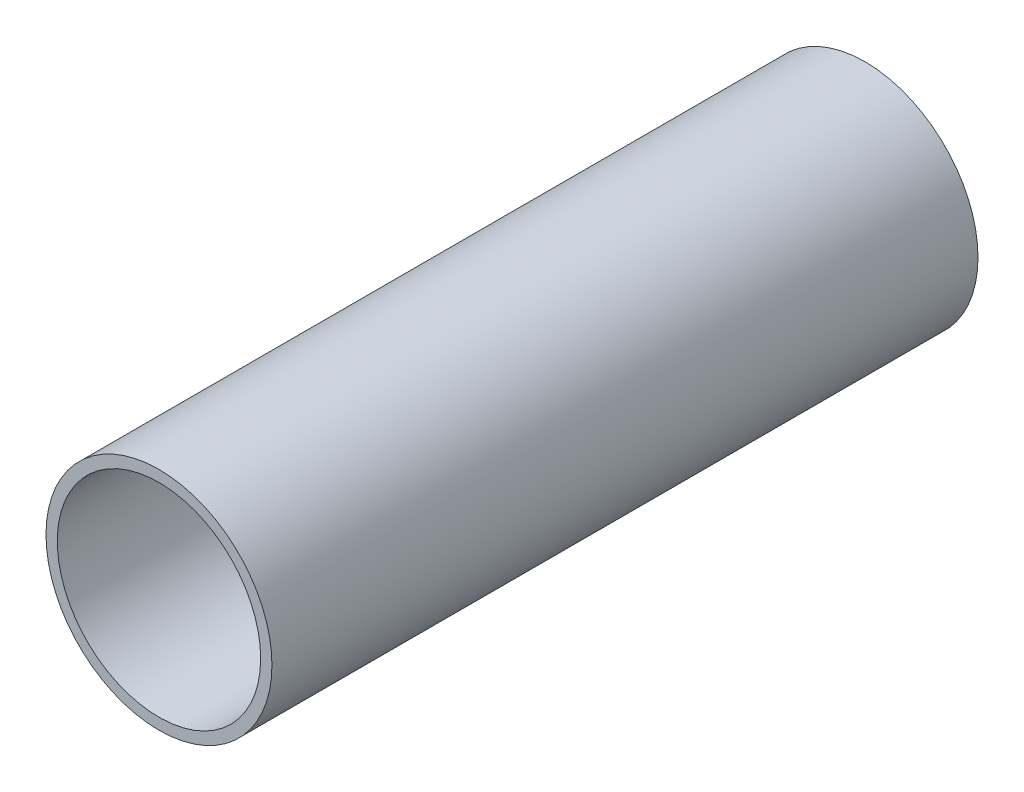
ISO-10303-21;
HEADER;
FILE_DESCRIPTION(('STEP AP214'),'2;1');
FILE_NAME('part.step','',(''),(''),'','','');
FILE_SCHEMA(('AUTOMOTIVE_DESIGN { 1 0 10303 214 1 1 1 1 }'));
ENDSEC;
DATA;
#1=APPLICATION_CONTEXT('core data for automotive mechanical design processes');
#2=APPLICATION_PROTOCOL_DEFINITION('international standard','automotive_design',2000,#1);
#3=PRODUCT_CONTEXT('',#1,'mechanical');
#4=PRODUCT('Part','Part','',(#3));
#5=PRODUCT_RELATED_PRODUCT_CATEGORY('part','',(#4));
#6=PRODUCT_DEFINITION_FORMATION('','',#4);
#7=PRODUCT_DEFINITION_CONTEXT('part definition',#1,'design');
#8=PRODUCT_DEFINITION('design','',#6,#7);
#9=PRODUCT_DEFINITION_SHAPE('','',#8);
#10=(LENGTH_UNIT() NAMED_UNIT(*) SI_UNIT(.MILLI.,.METRE.));
#11=(NAMED_UNIT(*) PLANE_ANGLE_UNIT() SI_UNIT($,.RADIAN.));
#12=(NAMED_UNIT(*) SI_UNIT($,.STERADIAN.) SOLID_ANGLE_UNIT());
#13=UNCERTAINTY_MEASURE_WITH_UNIT(LENGTH_MEASURE(1.E-05),#10,'distance_accuracy_value','');
#14=(GEOMETRIC_REPRESENTATION_CONTEXT(3) GLOBAL_UNCERTAINTY_ASSIGNED_CONTEXT((#13)) GLOBAL_UNIT_ASSIGNED_CONTEXT((#10,
#11,#12)) REPRESENTATION_CONTEXT('',''));
#15=CARTESIAN_POINT('',(0.,0.,0.));
#16=DIRECTION('',(0.,0.,1.));
#17=DIRECTION('',(1.,0.,0.));
#18=AXIS2_PLACEMENT_3D('',#15,#16,#17);
#19=CARTESIAN_POINT('',(717.030919156889,643.310257345695,1175.89547214137));
#20=DIRECTION('',(0.,0.,1.));
#21=DIRECTION('',(1.,0.,0.));
#22=AXIS2_PLACEMENT_3D('',#19,#20,#21);
#23=PLANE('',#22);
#24=CARTESIAN_POINT('',(717.030919156889,643.310257345695,1175.89547214137));
#25=DIRECTION('',(0.,0.,1.));
#26=DIRECTION('',(1.,0.,0.));
#27=AXIS2_PLACEMENT_3D('',#24,#25,#26);
#28=CIRCLE('',#27,20.);
#29=CARTESIAN_POINT('',(737.030919156889,643.310257345695,1175.89547214137));
#30=VERTEX_POINT('',#29);
#31=EDGE_CURVE('E9',#30,#30,#28,.T.);
#32=ORIENTED_EDGE('',*,*,#31,.T.);
#33=EDGE_LOOP('',(#32));
#34=FACE_BOUND('',#33,.T.);
#35=CARTESIAN_POINT('',(717.030919156889,643.310257345695,1175.89547214137));
#36=DIRECTION('',(0.,0.,1.));
#37=DIRECTION('',(1.,0.,0.));
#38=AXIS2_PLACEMENT_3D('',#35,#36,#37);
#39=CIRCLE('',#38,18.);
#40=CARTESIAN_POINT('',(735.030919156889,643.310257345695,1175.89547214137));
#41=VERTEX_POINT('',#40);
#42=EDGE_CURVE('E24',#41,#41,#39,.T.);
#43=ORIENTED_EDGE('',*,*,#42,.F.);
#44=EDGE_LOOP('',(#43));
#45=FACE_BOUND('',#44,.T.);
#46=ADVANCED_FACE('F13',(#34,#45),#23,.T.);
#47=CARTESIAN_POINT('',(717.030919156889,643.310257345695,1050.89547214137));
#48=DIRECTION('',(0.,0.,1.));
#49=DIRECTION('',(1.,0.,0.));
#50=AXIS2_PLACEMENT_3D('',#47,#48,#49);
#51=PLANE('',#50);
#52=CARTESIAN_POINT('',(717.030919156889,643.310257345695,1050.89547214137));
#53=DIRECTION('',(0.,0.,1.));
#54=DIRECTION('',(1.,0.,0.));
#55=AXIS2_PLACEMENT_3D('',#52,#53,#54);
#56=CIRCLE('',#55,20.);
#57=CARTESIAN_POINT('',(737.030919156889,643.310257345695,1050.89547214137));
#58=VERTEX_POINT('',#57);
#59=EDGE_CURVE('E17',#58,#58,#56,.T.);
#60=ORIENTED_EDGE('',*,*,#59,.F.);
#61=EDGE_LOOP('',(#60));
#62=FACE_BOUND('',#61,.T.);
#63=CARTESIAN_POINT('',(717.030919156889,643.310257345695,1050.89547214137));
#64=DIRECTION('',(0.,0.,1.));
#65=DIRECTION('',(1.,0.,0.));
#66=AXIS2_PLACEMENT_3D('',#63,#64,#65);
#67=CIRCLE('',#66,18.);
#68=CARTESIAN_POINT('',(735.030919156889,643.310257345695,1050.89547214137));
#69=VERTEX_POINT('',#68);
#70=EDGE_CURVE('E26',#69,#69,#67,.T.);
#71=ORIENTED_EDGE('',*,*,#70,.T.);
#72=EDGE_LOOP('',(#71));
#73=FACE_BOUND('',#72,.T.);
#74=ADVANCED_FACE('F36',(#62,#73),#51,.F.);
#75=CARTESIAN_POINT('',(717.030919156889,643.310257345695,1175.89547214137));
#76=DIRECTION('',(0.,0.,-1.));
#77=DIRECTION('',(-1.,0.,0.));
#78=AXIS2_PLACEMENT_3D('',#75,#76,#77);
#79=CYLINDRICAL_SURFACE('',#78,20.);
#80=ORIENTED_EDGE('',*,*,#31,.F.);
#81=EDGE_LOOP('',(#80));
#82=FACE_BOUND('',#81,.T.);
#83=ORIENTED_EDGE('',*,*,#59,.T.);
#84=EDGE_LOOP('',(#83));
#85=FACE_BOUND('',#84,.T.);
#86=ADVANCED_FACE('F15',(#82,#85),#79,.T.);
#87=CARTESIAN_POINT('',(717.030919156889,643.310257345695,1175.89547214137));
#88=DIRECTION('',(0.,0.,-1.));
#89=DIRECTION('',(-1.,0.,0.));
#90=AXIS2_PLACEMENT_3D('',#87,#88,#89);
#91=CYLINDRICAL_SURFACE('',#90,18.);
#92=ORIENTED_EDGE('',*,*,#42,.T.);
#93=EDGE_LOOP('',(#92));
#94=FACE_BOUND('',#93,.T.);
#95=ORIENTED_EDGE('',*,*,#70,.F.);
#96=EDGE_LOOP('',(#95));
#97=FACE_BOUND('',#96,.T.);
#98=ADVANCED_FACE('F32',(#94,#97),#91,.F.);
#99=CLOSED_SHELL('',(#46,#74,#86,#98));
#100=MANIFOLD_SOLID_BREP('B1',#99);
#101=ADVANCED_BREP_SHAPE_REPRESENTATION('',(#18,#100),#14);
#102=SHAPE_DEFINITION_REPRESENTATION(#9,#101);
ENDSEC;
END-ISO-10303-21;
